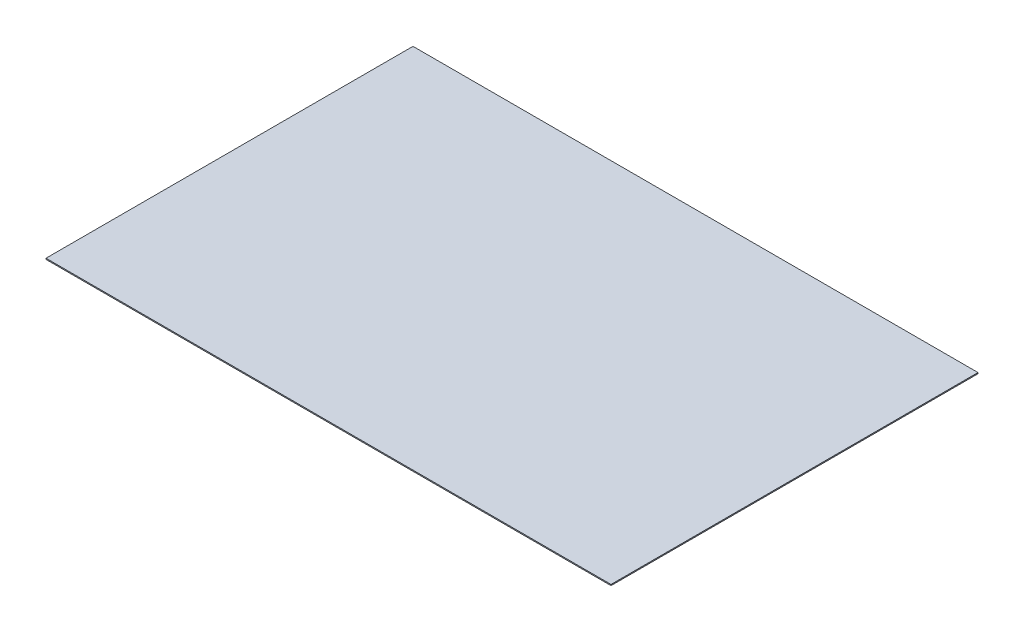
ISO-10303-21;
HEADER;
FILE_DESCRIPTION(('STEP AP214'),'2;1');
FILE_NAME('part.step','',(''),(''),'','','');
FILE_SCHEMA(('AUTOMOTIVE_DESIGN { 1 0 10303 214 1 1 1 1 }'));
ENDSEC;
DATA;
#1=APPLICATION_CONTEXT('core data for automotive mechanical design processes');
#2=APPLICATION_PROTOCOL_DEFINITION('international standard','automotive_design',2000,#1);
#3=PRODUCT_CONTEXT('',#1,'mechanical');
#4=PRODUCT('Part','Part','',(#3));
#5=PRODUCT_RELATED_PRODUCT_CATEGORY('part','',(#4));
#6=PRODUCT_DEFINITION_FORMATION('','',#4);
#7=PRODUCT_DEFINITION_CONTEXT('part definition',#1,'design');
#8=PRODUCT_DEFINITION('design','',#6,#7);
#9=PRODUCT_DEFINITION_SHAPE('','',#8);
#10=(LENGTH_UNIT() NAMED_UNIT(*) SI_UNIT(.MILLI.,.METRE.));
#11=(NAMED_UNIT(*) PLANE_ANGLE_UNIT() SI_UNIT($,.RADIAN.));
#12=(NAMED_UNIT(*) SI_UNIT($,.STERADIAN.) SOLID_ANGLE_UNIT());
#13=UNCERTAINTY_MEASURE_WITH_UNIT(LENGTH_MEASURE(1.E-05),#10,'distance_accuracy_value','');
#14=(GEOMETRIC_REPRESENTATION_CONTEXT(3) GLOBAL_UNCERTAINTY_ASSIGNED_CONTEXT((#13)) GLOBAL_UNIT_ASSIGNED_CONTEXT((#10,
#11,#12)) REPRESENTATION_CONTEXT('',''));
#15=CARTESIAN_POINT('',(0.,0.,0.));
#16=DIRECTION('',(0.,0.,1.));
#17=DIRECTION('',(1.,0.,0.));
#18=AXIS2_PLACEMENT_3D('',#15,#16,#17);
#19=CARTESIAN_POINT('',(-37.32,1.532,-25.12));
#20=DIRECTION('',(0.,1.,0.));
#21=DIRECTION('',(0.,0.,1.));
#22=AXIS2_PLACEMENT_3D('',#19,#20,#21);
#23=PLANE('',#22);
#24=DIRECTION('',(1.,0.,0.));
#25=VECTOR('',#24,1.);
#26=CARTESIAN_POINT('',(-37.32,1.532,19.32));
#27=LINE('',#26,#25);
#28=CARTESIAN_POINT('',(-31.1,1.532,19.32));
#29=VERTEX_POINT('',#28);
#30=CARTESIAN_POINT('',(31.1,1.532,19.32));
#31=VERTEX_POINT('',#30);
#32=EDGE_CURVE('E79',#29,#31,#27,.T.);
#33=ORIENTED_EDGE('',*,*,#32,.F.);
#34=DIRECTION('',(0.,0.,1.));
#35=VECTOR('',#34,1.);
#36=CARTESIAN_POINT('',(-31.1,1.532,-25.12));
#37=LINE('',#36,#35);
#38=CARTESIAN_POINT('',(-31.1,1.532,-21.08));
#39=VERTEX_POINT('',#38);
#40=EDGE_CURVE('E55',#39,#29,#37,.T.);
#41=ORIENTED_EDGE('',*,*,#40,.F.);
#42=DIRECTION('',(-1.,0.,0.));
#43=VECTOR('',#42,1.);
#44=CARTESIAN_POINT('',(37.32,1.532,-21.08));
#45=LINE('',#44,#43);
#46=CARTESIAN_POINT('',(31.1,1.532,-21.08));
#47=VERTEX_POINT('',#46);
#48=EDGE_CURVE('E57',#47,#39,#45,.T.);
#49=ORIENTED_EDGE('',*,*,#48,.F.);
#50=DIRECTION('',(0.,0.,-1.));
#51=VECTOR('',#50,1.);
#52=CARTESIAN_POINT('',(31.1,1.532,23.36));
#53=LINE('',#52,#51);
#54=EDGE_CURVE('E20',#31,#47,#53,.T.);
#55=ORIENTED_EDGE('',*,*,#54,.F.);
#56=EDGE_LOOP('',(#33,#41,#49,#55));
#57=FACE_BOUND('',#56,.T.);
#58=ADVANCED_FACE('F17',(#57),#23,.F.);
#59=CARTESIAN_POINT('',(31.1,1.52,23.36));
#60=DIRECTION('',(1.,0.,0.));
#61=DIRECTION('',(0.,0.,-1.));
#62=AXIS2_PLACEMENT_3D('',#59,#60,#61);
#63=PLANE('',#62);
#64=DIRECTION('',(0.,0.,1.));
#65=VECTOR('',#64,1.);
#66=CARTESIAN_POINT('',(31.1,1.652,-25.12));
#67=LINE('',#66,#65);
#68=CARTESIAN_POINT('',(31.1,1.652,19.32));
#69=VERTEX_POINT('',#68);
#70=CARTESIAN_POINT('',(31.1,1.652,-21.08));
#71=VERTEX_POINT('',#70);
#72=EDGE_CURVE('E83',#69,#71,#67,.F.);
#73=ORIENTED_EDGE('',*,*,#72,.F.);
#74=DIRECTION('',(0.,1.,0.));
#75=VECTOR('',#74,1.);
#76=CARTESIAN_POINT('',(31.1,1.52,19.32));
#77=LINE('',#76,#75);
#78=EDGE_CURVE('E68',#31,#69,#77,.T.);
#79=ORIENTED_EDGE('',*,*,#78,.F.);
#80=ORIENTED_EDGE('',*,*,#54,.T.);
#81=DIRECTION('',(0.,1.,0.));
#82=VECTOR('',#81,1.);
#83=CARTESIAN_POINT('',(31.1,1.52,-21.08));
#84=LINE('',#83,#82);
#85=EDGE_CURVE('E63',#71,#47,#84,.F.);
#86=ORIENTED_EDGE('',*,*,#85,.F.);
#87=EDGE_LOOP('',(#73,#79,#80,#86));
#88=FACE_BOUND('',#87,.T.);
#89=ADVANCED_FACE('F65',(#88),#63,.T.);
#90=CARTESIAN_POINT('',(37.32,1.52,-21.08));
#91=DIRECTION('',(0.,0.,-1.));
#92=DIRECTION('',(-1.,0.,0.));
#93=AXIS2_PLACEMENT_3D('',#90,#91,#92);
#94=PLANE('',#93);
#95=DIRECTION('',(1.,0.,0.));
#96=VECTOR('',#95,1.);
#97=CARTESIAN_POINT('',(-37.32,1.652,-21.08));
#98=LINE('',#97,#96);
#99=CARTESIAN_POINT('',(-31.1,1.652,-21.08));
#100=VERTEX_POINT('',#99);
#101=EDGE_CURVE('E72',#71,#100,#98,.F.);
#102=ORIENTED_EDGE('',*,*,#101,.F.);
#103=ORIENTED_EDGE('',*,*,#85,.T.);
#104=ORIENTED_EDGE('',*,*,#48,.T.);
#105=DIRECTION('',(0.,1.,0.));
#106=VECTOR('',#105,1.);
#107=CARTESIAN_POINT('',(-31.1,1.52,-21.08));
#108=LINE('',#107,#106);
#109=EDGE_CURVE('E75',#100,#39,#108,.F.);
#110=ORIENTED_EDGE('',*,*,#109,.F.);
#111=EDGE_LOOP('',(#102,#103,#104,#110));
#112=FACE_BOUND('',#111,.T.);
#113=ADVANCED_FACE('F70',(#112),#94,.T.);
#114=CARTESIAN_POINT('',(-31.1,1.52,-25.12));
#115=DIRECTION('',(-1.,0.,0.));
#116=DIRECTION('',(0.,0.,1.));
#117=AXIS2_PLACEMENT_3D('',#114,#115,#116);
#118=PLANE('',#117);
#119=DIRECTION('',(0.,0.,1.));
#120=VECTOR('',#119,1.);
#121=CARTESIAN_POINT('',(-31.1,1.652,-25.12));
#122=LINE('',#121,#120);
#123=CARTESIAN_POINT('',(-31.1,1.652,19.32));
#124=VERTEX_POINT('',#123);
#125=EDGE_CURVE('E26',#100,#124,#122,.T.);
#126=ORIENTED_EDGE('',*,*,#125,.F.);
#127=ORIENTED_EDGE('',*,*,#109,.T.);
#128=ORIENTED_EDGE('',*,*,#40,.T.);
#129=DIRECTION('',(0.,1.,0.));
#130=VECTOR('',#129,1.);
#131=CARTESIAN_POINT('',(-31.1,1.52,19.32));
#132=LINE('',#131,#130);
#133=EDGE_CURVE('E35',#124,#29,#132,.F.);
#134=ORIENTED_EDGE('',*,*,#133,.F.);
#135=EDGE_LOOP('',(#126,#127,#128,#134));
#136=FACE_BOUND('',#135,.T.);
#137=ADVANCED_FACE('F89',(#136),#118,.T.);
#138=CARTESIAN_POINT('',(-37.32,1.52,19.32));
#139=DIRECTION('',(0.,0.,1.));
#140=DIRECTION('',(1.,0.,0.));
#141=AXIS2_PLACEMENT_3D('',#138,#139,#140);
#142=PLANE('',#141);
#143=DIRECTION('',(1.,0.,0.));
#144=VECTOR('',#143,1.);
#145=CARTESIAN_POINT('',(-37.32,1.652,19.32));
#146=LINE('',#145,#144);
#147=EDGE_CURVE('E11',#124,#69,#146,.T.);
#148=ORIENTED_EDGE('',*,*,#147,.F.);
#149=ORIENTED_EDGE('',*,*,#133,.T.);
#150=ORIENTED_EDGE('',*,*,#32,.T.);
#151=ORIENTED_EDGE('',*,*,#78,.T.);
#152=EDGE_LOOP('',(#148,#149,#150,#151));
#153=FACE_BOUND('',#152,.T.);
#154=ADVANCED_FACE('F91',(#153),#142,.T.);
#155=CARTESIAN_POINT('',(-37.32,1.652,-25.12));
#156=DIRECTION('',(0.,1.,0.));
#157=DIRECTION('',(0.,0.,1.));
#158=AXIS2_PLACEMENT_3D('',#155,#156,#157);
#159=PLANE('',#158);
#160=ORIENTED_EDGE('',*,*,#125,.T.);
#161=ORIENTED_EDGE('',*,*,#147,.T.);
#162=ORIENTED_EDGE('',*,*,#72,.T.);
#163=ORIENTED_EDGE('',*,*,#101,.T.);
#164=EDGE_LOOP('',(#160,#161,#162,#163));
#165=FACE_BOUND('',#164,.T.);
#166=ADVANCED_FACE('F88',(#165),#159,.T.);
#167=CLOSED_SHELL('',(#58,#89,#113,#137,#154,#166));
#168=MANIFOLD_SOLID_BREP('B1',#167);
#169=ADVANCED_BREP_SHAPE_REPRESENTATION('',(#18,#168),#14);
#170=SHAPE_DEFINITION_REPRESENTATION(#9,#169);
ENDSEC;
END-ISO-10303-21;
